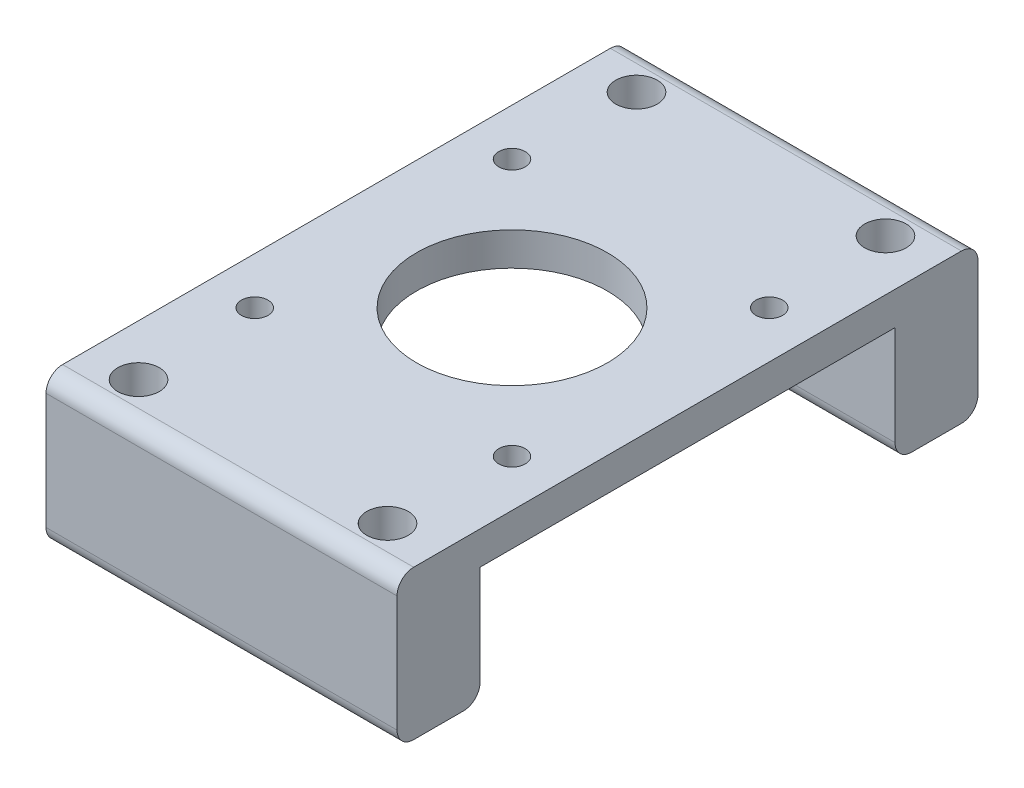
ISO-10303-21;
HEADER;
FILE_DESCRIPTION(('STEP AP214'),'2;1');
FILE_NAME('part.step','',(''),(''),'','','');
FILE_SCHEMA(('AUTOMOTIVE_DESIGN { 1 0 10303 214 1 1 1 1 }'));
ENDSEC;
DATA;
#1=APPLICATION_CONTEXT('core data for automotive mechanical design processes');
#2=APPLICATION_PROTOCOL_DEFINITION('international standard','automotive_design',2000,#1);
#3=PRODUCT_CONTEXT('',#1,'mechanical');
#4=PRODUCT('Part','Part','',(#3));
#5=PRODUCT_RELATED_PRODUCT_CATEGORY('part','',(#4));
#6=PRODUCT_DEFINITION_FORMATION('','',#4);
#7=PRODUCT_DEFINITION_CONTEXT('part definition',#1,'design');
#8=PRODUCT_DEFINITION('design','',#6,#7);
#9=PRODUCT_DEFINITION_SHAPE('','',#8);
#10=(LENGTH_UNIT() NAMED_UNIT(*) SI_UNIT(.MILLI.,.METRE.));
#11=(NAMED_UNIT(*) PLANE_ANGLE_UNIT() SI_UNIT($,.RADIAN.));
#12=(NAMED_UNIT(*) SI_UNIT($,.STERADIAN.) SOLID_ANGLE_UNIT());
#13=UNCERTAINTY_MEASURE_WITH_UNIT(LENGTH_MEASURE(1.E-05),#10,'distance_accuracy_value','');
#14=(GEOMETRIC_REPRESENTATION_CONTEXT(3) GLOBAL_UNCERTAINTY_ASSIGNED_CONTEXT((#13)) GLOBAL_UNIT_ASSIGNED_CONTEXT((#10,
#11,#12)) REPRESENTATION_CONTEXT('',''));
#15=CARTESIAN_POINT('',(0.,0.,0.));
#16=DIRECTION('',(0.,0.,1.));
#17=DIRECTION('',(1.,0.,0.));
#18=AXIS2_PLACEMENT_3D('',#15,#16,#17);
#19=CARTESIAN_POINT('',(21.15,2.,0.));
#20=DIRECTION('',(0.,-1.,0.));
#21=DIRECTION('',(0.,0.,-1.));
#22=AXIS2_PLACEMENT_3D('',#19,#20,#21);
#23=PLANE('',#22);
#24=CARTESIAN_POINT('',(15.,2.00000000000001,30.));
#25=DIRECTION('',(0.,1.,0.));
#26=DIRECTION('',(0.,0.,1.));
#27=AXIS2_PLACEMENT_3D('',#24,#25,#26);
#28=CIRCLE('',#27,2.5);
#29=CARTESIAN_POINT('',(15.,2.00000000000001,32.5));
#30=VERTEX_POINT('',#29);
#31=EDGE_CURVE('E311',#30,#30,#28,.T.);
#32=ORIENTED_EDGE('',*,*,#31,.F.);
#33=EDGE_LOOP('',(#32));
#34=FACE_BOUND('',#33,.T.);
#35=CARTESIAN_POINT('',(-15.,2.00000000000001,30.));
#36=DIRECTION('',(0.,-1.,0.));
#37=DIRECTION('',(0.,0.,1.));
#38=AXIS2_PLACEMENT_3D('',#35,#36,#37);
#39=CIRCLE('',#38,2.5);
#40=CARTESIAN_POINT('',(-15.,2.00000000000001,32.5));
#41=VERTEX_POINT('',#40);
#42=EDGE_CURVE('E305',#41,#41,#39,.T.);
#43=ORIENTED_EDGE('',*,*,#42,.T.);
#44=EDGE_LOOP('',(#43));
#45=FACE_BOUND('',#44,.T.);
#46=CARTESIAN_POINT('',(-15.,2.00000000000001,-30.));
#47=DIRECTION('',(0.,1.,0.));
#48=DIRECTION('',(0.,0.,-1.));
#49=AXIS2_PLACEMENT_3D('',#46,#47,#48);
#50=CIRCLE('',#49,2.5);
#51=CARTESIAN_POINT('',(-15.,2.00000000000001,-32.5));
#52=VERTEX_POINT('',#51);
#53=EDGE_CURVE('E299',#52,#52,#50,.T.);
#54=ORIENTED_EDGE('',*,*,#53,.F.);
#55=EDGE_LOOP('',(#54));
#56=FACE_BOUND('',#55,.T.);
#57=CARTESIAN_POINT('',(15.,2.00000000000001,-30.));
#58=DIRECTION('',(0.,-1.,0.));
#59=DIRECTION('',(0.,0.,-1.));
#60=AXIS2_PLACEMENT_3D('',#57,#58,#59);
#61=CIRCLE('',#60,2.5);
#62=CARTESIAN_POINT('',(15.,2.00000000000001,-32.5));
#63=VERTEX_POINT('',#62);
#64=EDGE_CURVE('E295',#63,#63,#61,.T.);
#65=ORIENTED_EDGE('',*,*,#64,.T.);
#66=EDGE_LOOP('',(#65));
#67=FACE_BOUND('',#66,.T.);
#68=CARTESIAN_POINT('',(15.4999999999998,2.00000000000001,-15.5000000000002));
#69=DIRECTION('',(0.,1.,0.));
#70=DIRECTION('',(-1.,0.,0.));
#71=AXIS2_PLACEMENT_3D('',#68,#69,#70);
#72=CIRCLE('',#71,1.6);
#73=CARTESIAN_POINT('',(13.8999999999998,2.00000000000001,-15.5000000000001));
#74=VERTEX_POINT('',#73);
#75=EDGE_CURVE('E218',#74,#74,#72,.T.);
#76=ORIENTED_EDGE('',*,*,#75,.F.);
#77=EDGE_LOOP('',(#76));
#78=FACE_BOUND('',#77,.T.);
#79=CARTESIAN_POINT('',(15.5,2.,15.5));
#80=DIRECTION('',(0.,1.,0.));
#81=DIRECTION('',(0.,0.,-1.));
#82=AXIS2_PLACEMENT_3D('',#79,#80,#81);
#83=CIRCLE('',#82,1.6);
#84=CARTESIAN_POINT('',(15.5,2.,13.9));
#85=VERTEX_POINT('',#84);
#86=EDGE_CURVE('E214',#85,#85,#83,.T.);
#87=ORIENTED_EDGE('',*,*,#86,.F.);
#88=EDGE_LOOP('',(#87));
#89=FACE_BOUND('',#88,.T.);
#90=CARTESIAN_POINT('',(-15.4999999999999,2.,15.5000000000001));
#91=DIRECTION('',(0.,1.,0.));
#92=DIRECTION('',(1.,0.,0.));
#93=AXIS2_PLACEMENT_3D('',#90,#91,#92);
#94=CIRCLE('',#93,1.6);
#95=CARTESIAN_POINT('',(-13.8999999999999,2.,15.5));
#96=VERTEX_POINT('',#95);
#97=EDGE_CURVE('E210',#96,#96,#94,.T.);
#98=ORIENTED_EDGE('',*,*,#97,.F.);
#99=EDGE_LOOP('',(#98));
#100=FACE_BOUND('',#99,.T.);
#101=CARTESIAN_POINT('',(-15.5,2.00000000000001,-15.5));
#102=DIRECTION('',(0.,1.,0.));
#103=DIRECTION('',(0.,0.,1.));
#104=AXIS2_PLACEMENT_3D('',#101,#102,#103);
#105=CIRCLE('',#104,1.6);
#106=CARTESIAN_POINT('',(-15.5,2.00000000000001,-13.9));
#107=VERTEX_POINT('',#106);
#108=EDGE_CURVE('E206',#107,#107,#105,.T.);
#109=ORIENTED_EDGE('',*,*,#108,.F.);
#110=EDGE_LOOP('',(#109));
#111=FACE_BOUND('',#110,.T.);
#112=CARTESIAN_POINT('',(0.,2.,0.));
#113=DIRECTION('',(0.,1.,0.));
#114=DIRECTION('',(0.,0.,1.));
#115=AXIS2_PLACEMENT_3D('',#112,#113,#114);
#116=CIRCLE('',#115,11.5);
#117=CARTESIAN_POINT('',(0.,2.,11.5));
#118=VERTEX_POINT('',#117);
#119=EDGE_CURVE('E202',#118,#118,#116,.T.);
#120=ORIENTED_EDGE('',*,*,#119,.F.);
#121=EDGE_LOOP('',(#120));
#122=FACE_BOUND('',#121,.T.);
#123=DIRECTION('',(0.,0.,1.));
#124=VECTOR('',#123,1.);
#125=CARTESIAN_POINT('',(-21.15,2.,0.));
#126=LINE('',#125,#124);
#127=CARTESIAN_POINT('',(-21.15,2.00000000000001,-33.));
#128=VERTEX_POINT('',#127);
#129=CARTESIAN_POINT('',(-21.15,2.,33.));
#130=VERTEX_POINT('',#129);
#131=EDGE_CURVE('E176',#128,#130,#126,.T.);
#132=ORIENTED_EDGE('',*,*,#131,.T.);
#133=DIRECTION('',(-1.,0.,0.));
#134=VECTOR('',#133,1.);
#135=CARTESIAN_POINT('',(21.15,2.,33.));
#136=LINE('',#135,#134);
#137=CARTESIAN_POINT('',(21.15,2.,33.));
#138=VERTEX_POINT('',#137);
#139=EDGE_CURVE('E11',#130,#138,#136,.F.);
#140=ORIENTED_EDGE('',*,*,#139,.T.);
#141=DIRECTION('',(0.,0.,1.));
#142=VECTOR('',#141,1.);
#143=CARTESIAN_POINT('',(21.15,2.,0.));
#144=LINE('',#143,#142);
#145=CARTESIAN_POINT('',(21.15,2.00000000000001,-33.));
#146=VERTEX_POINT('',#145);
#147=EDGE_CURVE('E198',#146,#138,#144,.T.);
#148=ORIENTED_EDGE('',*,*,#147,.F.);
#149=DIRECTION('',(-1.,0.,0.));
#150=VECTOR('',#149,1.);
#151=CARTESIAN_POINT('',(-21.15,2.00000000000001,-33.));
#152=LINE('',#151,#150);
#153=EDGE_CURVE('E43',#146,#128,#152,.T.);
#154=ORIENTED_EDGE('',*,*,#153,.T.);
#155=EDGE_LOOP('',(#132,#140,#148,#154));
#156=FACE_BOUND('',#155,.T.);
#157=ADVANCED_FACE('F35',(#34,#45,#56,#67,#78,#89,#100,#111,#122,#156),#23,.F.);
#158=CARTESIAN_POINT('',(21.15,0.,35.));
#159=DIRECTION('',(0.,0.,-1.));
#160=DIRECTION('',(0.,1.,0.));
#161=AXIS2_PLACEMENT_3D('',#158,#159,#160);
#162=PLANE('',#161);
#163=DIRECTION('',(0.,-1.,0.));
#164=VECTOR('',#163,1.);
#165=CARTESIAN_POINT('',(-21.15,0.,35.));
#166=LINE('',#165,#164);
#167=CARTESIAN_POINT('',(-21.15,0.,35.));
#168=VERTEX_POINT('',#167);
#169=CARTESIAN_POINT('',(-21.15,-14.,35.));
#170=VERTEX_POINT('',#169);
#171=EDGE_CURVE('E179',#168,#170,#166,.T.);
#172=ORIENTED_EDGE('',*,*,#171,.T.);
#173=DIRECTION('',(-1.,0.,0.));
#174=VECTOR('',#173,1.);
#175=CARTESIAN_POINT('',(21.15,-14.,35.));
#176=LINE('',#175,#174);
#177=CARTESIAN_POINT('',(21.15,-14.,35.));
#178=VERTEX_POINT('',#177);
#179=EDGE_CURVE('E238',#170,#178,#176,.F.);
#180=ORIENTED_EDGE('',*,*,#179,.T.);
#181=DIRECTION('',(0.,-1.,0.));
#182=VECTOR('',#181,1.);
#183=CARTESIAN_POINT('',(21.15,0.,35.));
#184=LINE('',#183,#182);
#185=CARTESIAN_POINT('',(21.15,0.,35.));
#186=VERTEX_POINT('',#185);
#187=EDGE_CURVE('E167',#186,#178,#184,.T.);
#188=ORIENTED_EDGE('',*,*,#187,.F.);
#189=DIRECTION('',(-1.,0.,0.));
#190=VECTOR('',#189,1.);
#191=CARTESIAN_POINT('',(21.15,0.,35.));
#192=LINE('',#191,#190);
#193=EDGE_CURVE('E235',#186,#168,#192,.T.);
#194=ORIENTED_EDGE('',*,*,#193,.T.);
#195=EDGE_LOOP('',(#172,#180,#188,#194));
#196=FACE_BOUND('',#195,.T.);
#197=ADVANCED_FACE('F280',(#196),#162,.F.);
#198=CARTESIAN_POINT('',(21.15,-16.,0.));
#199=DIRECTION('',(0.,-1.,0.));
#200=DIRECTION('',(0.,0.,-1.));
#201=AXIS2_PLACEMENT_3D('',#198,#199,#200);
#202=PLANE('',#201);
#203=CARTESIAN_POINT('',(15.,-16.,30.));
#204=DIRECTION('',(0.,1.,0.));
#205=DIRECTION('',(0.,0.,1.));
#206=AXIS2_PLACEMENT_3D('',#203,#204,#205);
#207=CIRCLE('',#206,2.5);
#208=CARTESIAN_POINT('',(15.,-16.,32.5));
#209=VERTEX_POINT('',#208);
#210=EDGE_CURVE('E314',#209,#209,#207,.T.);
#211=ORIENTED_EDGE('',*,*,#210,.T.);
#212=EDGE_LOOP('',(#211));
#213=FACE_BOUND('',#212,.T.);
#214=CARTESIAN_POINT('',(-15.,-16.,30.));
#215=DIRECTION('',(0.,-1.,0.));
#216=DIRECTION('',(0.,0.,1.));
#217=AXIS2_PLACEMENT_3D('',#214,#215,#216);
#218=CIRCLE('',#217,2.5);
#219=CARTESIAN_POINT('',(-15.,-16.,32.5));
#220=VERTEX_POINT('',#219);
#221=EDGE_CURVE('E308',#220,#220,#218,.T.);
#222=ORIENTED_EDGE('',*,*,#221,.F.);
#223=EDGE_LOOP('',(#222));
#224=FACE_BOUND('',#223,.T.);
#225=DIRECTION('',(0.,0.,1.));
#226=VECTOR('',#225,1.);
#227=CARTESIAN_POINT('',(21.15,-16.,0.));
#228=LINE('',#227,#226);
#229=CARTESIAN_POINT('',(21.15,-16.,27.));
#230=VERTEX_POINT('',#229);
#231=CARTESIAN_POINT('',(21.15,-16.,33.));
#232=VERTEX_POINT('',#231);
#233=EDGE_CURVE('E164',#230,#232,#228,.T.);
#234=ORIENTED_EDGE('',*,*,#233,.T.);
#235=DIRECTION('',(-1.,0.,0.));
#236=VECTOR('',#235,1.);
#237=CARTESIAN_POINT('',(-21.15,-16.,33.));
#238=LINE('',#237,#236);
#239=CARTESIAN_POINT('',(-21.15,-16.,33.));
#240=VERTEX_POINT('',#239);
#241=EDGE_CURVE('E220',#232,#240,#238,.T.);
#242=ORIENTED_EDGE('',*,*,#241,.T.);
#243=DIRECTION('',(0.,0.,1.));
#244=VECTOR('',#243,1.);
#245=CARTESIAN_POINT('',(-21.15,-16.,0.));
#246=LINE('',#245,#244);
#247=CARTESIAN_POINT('',(-21.15,-16.,27.));
#248=VERTEX_POINT('',#247);
#249=EDGE_CURVE('E183',#248,#240,#246,.T.);
#250=ORIENTED_EDGE('',*,*,#249,.F.);
#251=DIRECTION('',(-1.,0.,0.));
#252=VECTOR('',#251,1.);
#253=CARTESIAN_POINT('',(21.15,-16.,27.));
#254=LINE('',#253,#252);
#255=EDGE_CURVE('E148',#248,#230,#254,.F.);
#256=ORIENTED_EDGE('',*,*,#255,.T.);
#257=EDGE_LOOP('',(#234,#242,#250,#256));
#258=FACE_BOUND('',#257,.T.);
#259=ADVANCED_FACE('F360',(#213,#224,#258),#202,.T.);
#260=CARTESIAN_POINT('',(21.15,0.,25.));
#261=DIRECTION('',(0.,0.,-1.));
#262=DIRECTION('',(0.,1.,0.));
#263=AXIS2_PLACEMENT_3D('',#260,#261,#262);
#264=PLANE('',#263);
#265=DIRECTION('',(0.,-1.,0.));
#266=VECTOR('',#265,1.);
#267=CARTESIAN_POINT('',(21.15,0.,25.));
#268=LINE('',#267,#266);
#269=CARTESIAN_POINT('',(21.15,-2.,25.));
#270=VERTEX_POINT('',#269);
#271=CARTESIAN_POINT('',(21.15,-14.,25.));
#272=VERTEX_POINT('',#271);
#273=EDGE_CURVE('E142',#270,#272,#268,.T.);
#274=ORIENTED_EDGE('',*,*,#273,.T.);
#275=DIRECTION('',(-1.,0.,0.));
#276=VECTOR('',#275,1.);
#277=CARTESIAN_POINT('',(21.15,-14.,25.));
#278=LINE('',#277,#276);
#279=CARTESIAN_POINT('',(-21.15,-14.,25.));
#280=VERTEX_POINT('',#279);
#281=EDGE_CURVE('E250',#272,#280,#278,.T.);
#282=ORIENTED_EDGE('',*,*,#281,.T.);
#283=DIRECTION('',(0.,-1.,0.));
#284=VECTOR('',#283,1.);
#285=CARTESIAN_POINT('',(-21.15,0.,25.));
#286=LINE('',#285,#284);
#287=CARTESIAN_POINT('',(-21.15,-2.,25.));
#288=VERTEX_POINT('',#287);
#289=EDGE_CURVE('E145',#288,#280,#286,.T.);
#290=ORIENTED_EDGE('',*,*,#289,.F.);
#291=DIRECTION('',(-1.,0.,0.));
#292=VECTOR('',#291,1.);
#293=CARTESIAN_POINT('',(21.15,-2.,25.));
#294=LINE('',#293,#292);
#295=EDGE_CURVE('E137',#270,#288,#294,.T.);
#296=ORIENTED_EDGE('',*,*,#295,.F.);
#297=EDGE_LOOP('',(#274,#282,#290,#296));
#298=FACE_BOUND('',#297,.T.);
#299=ADVANCED_FACE('F139',(#298),#264,.T.);
#300=CARTESIAN_POINT('',(21.15,-2.,0.));
#301=DIRECTION('',(0.,1.,0.));
#302=DIRECTION('',(0.,0.,1.));
#303=AXIS2_PLACEMENT_3D('',#300,#301,#302);
#304=PLANE('',#303);
#305=CARTESIAN_POINT('',(15.4999999999998,-2.,-15.5000000000002));
#306=DIRECTION('',(0.,1.,0.));
#307=DIRECTION('',(0.,0.,1.));
#308=AXIS2_PLACEMENT_3D('',#305,#306,#307);
#309=CIRCLE('',#308,1.6);
#310=CARTESIAN_POINT('',(15.4999999999998,-2.,-13.9000000000002));
#311=VERTEX_POINT('',#310);
#312=EDGE_CURVE('E215',#311,#311,#309,.T.);
#313=ORIENTED_EDGE('',*,*,#312,.T.);
#314=EDGE_LOOP('',(#313));
#315=FACE_BOUND('',#314,.T.);
#316=CARTESIAN_POINT('',(15.5,-2.,15.5));
#317=DIRECTION('',(0.,1.,0.));
#318=DIRECTION('',(0.,0.,1.));
#319=AXIS2_PLACEMENT_3D('',#316,#317,#318);
#320=CIRCLE('',#319,1.6);
#321=CARTESIAN_POINT('',(15.5,-2.,17.1));
#322=VERTEX_POINT('',#321);
#323=EDGE_CURVE('E211',#322,#322,#320,.T.);
#324=ORIENTED_EDGE('',*,*,#323,.T.);
#325=EDGE_LOOP('',(#324));
#326=FACE_BOUND('',#325,.T.);
#327=CARTESIAN_POINT('',(-15.4999999999999,-2.,15.5000000000001));
#328=DIRECTION('',(0.,1.,0.));
#329=DIRECTION('',(0.,0.,1.));
#330=AXIS2_PLACEMENT_3D('',#327,#328,#329);
#331=CIRCLE('',#330,1.6);
#332=CARTESIAN_POINT('',(-15.4999999999999,-2.,17.1000000000001));
#333=VERTEX_POINT('',#332);
#334=EDGE_CURVE('E207',#333,#333,#331,.T.);
#335=ORIENTED_EDGE('',*,*,#334,.T.);
#336=EDGE_LOOP('',(#335));
#337=FACE_BOUND('',#336,.T.);
#338=CARTESIAN_POINT('',(-15.5,-2.,-15.5));
#339=DIRECTION('',(0.,1.,0.));
#340=DIRECTION('',(0.,0.,1.));
#341=AXIS2_PLACEMENT_3D('',#338,#339,#340);
#342=CIRCLE('',#341,1.6);
#343=CARTESIAN_POINT('',(-15.5,-2.,-13.9));
#344=VERTEX_POINT('',#343);
#345=EDGE_CURVE('E203',#344,#344,#342,.T.);
#346=ORIENTED_EDGE('',*,*,#345,.T.);
#347=EDGE_LOOP('',(#346));
#348=FACE_BOUND('',#347,.T.);
#349=CARTESIAN_POINT('',(0.,-2.,0.));
#350=DIRECTION('',(0.,1.,0.));
#351=DIRECTION('',(0.,0.,1.));
#352=AXIS2_PLACEMENT_3D('',#349,#350,#351);
#353=CIRCLE('',#352,11.5);
#354=CARTESIAN_POINT('',(0.,-2.,11.5));
#355=VERTEX_POINT('',#354);
#356=EDGE_CURVE('E180',#355,#355,#353,.T.);
#357=ORIENTED_EDGE('',*,*,#356,.T.);
#358=EDGE_LOOP('',(#357));
#359=FACE_BOUND('',#358,.T.);
#360=DIRECTION('',(0.,0.,-1.));
#361=VECTOR('',#360,1.);
#362=CARTESIAN_POINT('',(-21.15,-2.,0.));
#363=LINE('',#362,#361);
#364=CARTESIAN_POINT('',(-21.15,-2.,-25.));
#365=VERTEX_POINT('',#364);
#366=EDGE_CURVE('E187',#288,#365,#363,.T.);
#367=ORIENTED_EDGE('',*,*,#366,.T.);
#368=DIRECTION('',(-1.,0.,0.));
#369=VECTOR('',#368,1.);
#370=CARTESIAN_POINT('',(21.15,-2.,-25.));
#371=LINE('',#370,#369);
#372=CARTESIAN_POINT('',(21.15,-2.,-25.));
#373=VERTEX_POINT('',#372);
#374=EDGE_CURVE('E149',#373,#365,#371,.T.);
#375=ORIENTED_EDGE('',*,*,#374,.F.);
#376=DIRECTION('',(0.,0.,-1.));
#377=VECTOR('',#376,1.);
#378=CARTESIAN_POINT('',(21.15,-2.,0.));
#379=LINE('',#378,#377);
#380=EDGE_CURVE('E152',#270,#373,#379,.T.);
#381=ORIENTED_EDGE('',*,*,#380,.F.);
#382=ORIENTED_EDGE('',*,*,#295,.T.);
#383=EDGE_LOOP('',(#367,#375,#381,#382));
#384=FACE_BOUND('',#383,.T.);
#385=ADVANCED_FACE('F153',(#315,#326,#337,#348,#359,#384),#304,.F.);
#386=CARTESIAN_POINT('',(21.15,0.,-25.));
#387=DIRECTION('',(0.,0.,-1.));
#388=DIRECTION('',(-1.,0.,0.));
#389=AXIS2_PLACEMENT_3D('',#386,#387,#388);
#390=PLANE('',#389);
#391=DIRECTION('',(0.,-1.,0.));
#392=VECTOR('',#391,1.);
#393=CARTESIAN_POINT('',(-21.15,0.,-25.));
#394=LINE('',#393,#392);
#395=CARTESIAN_POINT('',(-21.15,-14.,-25.));
#396=VERTEX_POINT('',#395);
#397=EDGE_CURVE('E189',#365,#396,#394,.T.);
#398=ORIENTED_EDGE('',*,*,#397,.T.);
#399=DIRECTION('',(-1.,0.,0.));
#400=VECTOR('',#399,1.);
#401=CARTESIAN_POINT('',(21.15,-14.,-25.));
#402=LINE('',#401,#400);
#403=CARTESIAN_POINT('',(21.15,-14.,-25.));
#404=VERTEX_POINT('',#403);
#405=EDGE_CURVE('E261',#396,#404,#402,.F.);
#406=ORIENTED_EDGE('',*,*,#405,.T.);
#407=DIRECTION('',(0.,-1.,0.));
#408=VECTOR('',#407,1.);
#409=CARTESIAN_POINT('',(21.15,0.,-25.));
#410=LINE('',#409,#408);
#411=EDGE_CURVE('E157',#373,#404,#410,.T.);
#412=ORIENTED_EDGE('',*,*,#411,.F.);
#413=ORIENTED_EDGE('',*,*,#374,.T.);
#414=EDGE_LOOP('',(#398,#406,#412,#413));
#415=FACE_BOUND('',#414,.T.);
#416=ADVANCED_FACE('F350',(#415),#390,.F.);
#417=CARTESIAN_POINT('',(21.15,-16.,0.));
#418=DIRECTION('',(0.,1.,0.));
#419=DIRECTION('',(0.,0.,1.));
#420=AXIS2_PLACEMENT_3D('',#417,#418,#419);
#421=PLANE('',#420);
#422=CARTESIAN_POINT('',(-15.,-16.,-30.));
#423=DIRECTION('',(0.,1.,0.));
#424=DIRECTION('',(0.,0.,-1.));
#425=AXIS2_PLACEMENT_3D('',#422,#423,#424);
#426=CIRCLE('',#425,2.5);
#427=CARTESIAN_POINT('',(-15.,-16.,-32.5));
#428=VERTEX_POINT('',#427);
#429=EDGE_CURVE('E302',#428,#428,#426,.T.);
#430=ORIENTED_EDGE('',*,*,#429,.T.);
#431=EDGE_LOOP('',(#430));
#432=FACE_BOUND('',#431,.T.);
#433=CARTESIAN_POINT('',(15.,-16.,-30.));
#434=DIRECTION('',(0.,-1.,0.));
#435=DIRECTION('',(0.,0.,-1.));
#436=AXIS2_PLACEMENT_3D('',#433,#434,#435);
#437=CIRCLE('',#436,2.5);
#438=CARTESIAN_POINT('',(15.,-16.,-32.5));
#439=VERTEX_POINT('',#438);
#440=EDGE_CURVE('E296',#439,#439,#437,.T.);
#441=ORIENTED_EDGE('',*,*,#440,.F.);
#442=EDGE_LOOP('',(#441));
#443=FACE_BOUND('',#442,.T.);
#444=DIRECTION('',(0.,0.,-1.));
#445=VECTOR('',#444,1.);
#446=CARTESIAN_POINT('',(-21.15,-16.,0.));
#447=LINE('',#446,#445);
#448=CARTESIAN_POINT('',(-21.15,-16.,-27.));
#449=VERTEX_POINT('',#448);
#450=CARTESIAN_POINT('',(-21.15,-16.,-33.));
#451=VERTEX_POINT('',#450);
#452=EDGE_CURVE('E192',#449,#451,#447,.T.);
#453=ORIENTED_EDGE('',*,*,#452,.T.);
#454=DIRECTION('',(-1.,0.,0.));
#455=VECTOR('',#454,1.);
#456=CARTESIAN_POINT('',(21.15,-16.,-33.));
#457=LINE('',#456,#455);
#458=CARTESIAN_POINT('',(21.15,-16.,-33.));
#459=VERTEX_POINT('',#458);
#460=EDGE_CURVE('E259',#451,#459,#457,.F.);
#461=ORIENTED_EDGE('',*,*,#460,.T.);
#462=DIRECTION('',(0.,0.,-1.));
#463=VECTOR('',#462,1.);
#464=CARTESIAN_POINT('',(21.15,-16.,0.));
#465=LINE('',#464,#463);
#466=CARTESIAN_POINT('',(21.15,-16.,-27.));
#467=VERTEX_POINT('',#466);
#468=EDGE_CURVE('E172',#467,#459,#465,.T.);
#469=ORIENTED_EDGE('',*,*,#468,.F.);
#470=DIRECTION('',(-1.,0.,0.));
#471=VECTOR('',#470,1.);
#472=CARTESIAN_POINT('',(21.15,-16.,-27.));
#473=LINE('',#472,#471);
#474=EDGE_CURVE('E256',#467,#449,#473,.T.);
#475=ORIENTED_EDGE('',*,*,#474,.T.);
#476=EDGE_LOOP('',(#453,#461,#469,#475));
#477=FACE_BOUND('',#476,.T.);
#478=ADVANCED_FACE('F357',(#432,#443,#477),#421,.F.);
#479=CARTESIAN_POINT('',(21.15,0.,-35.));
#480=DIRECTION('',(0.,0.,-1.));
#481=DIRECTION('',(-1.,0.,0.));
#482=AXIS2_PLACEMENT_3D('',#479,#480,#481);
#483=PLANE('',#482);
#484=DIRECTION('',(0.,-1.,0.));
#485=VECTOR('',#484,1.);
#486=CARTESIAN_POINT('',(21.15,0.,-35.));
#487=LINE('',#486,#485);
#488=CARTESIAN_POINT('',(21.15,0.,-35.));
#489=VERTEX_POINT('',#488);
#490=CARTESIAN_POINT('',(21.15,-14.,-35.));
#491=VERTEX_POINT('',#490);
#492=EDGE_CURVE('E174',#489,#491,#487,.T.);
#493=ORIENTED_EDGE('',*,*,#492,.T.);
#494=DIRECTION('',(-1.,0.,0.));
#495=VECTOR('',#494,1.);
#496=CARTESIAN_POINT('',(-21.15,-14.,-35.));
#497=LINE('',#496,#495);
#498=CARTESIAN_POINT('',(-21.15,-14.,-35.));
#499=VERTEX_POINT('',#498);
#500=EDGE_CURVE('E253',#491,#499,#497,.T.);
#501=ORIENTED_EDGE('',*,*,#500,.T.);
#502=DIRECTION('',(0.,-1.,0.));
#503=VECTOR('',#502,1.);
#504=CARTESIAN_POINT('',(-21.15,0.,-35.));
#505=LINE('',#504,#503);
#506=CARTESIAN_POINT('',(-21.15,0.,-35.));
#507=VERTEX_POINT('',#506);
#508=EDGE_CURVE('E195',#507,#499,#505,.T.);
#509=ORIENTED_EDGE('',*,*,#508,.F.);
#510=DIRECTION('',(-1.,0.,0.));
#511=VECTOR('',#510,1.);
#512=CARTESIAN_POINT('',(21.15,0.,-35.));
#513=LINE('',#512,#511);
#514=EDGE_CURVE('E57',#507,#489,#513,.F.);
#515=ORIENTED_EDGE('',*,*,#514,.T.);
#516=EDGE_LOOP('',(#493,#501,#509,#515));
#517=FACE_BOUND('',#516,.T.);
#518=ADVANCED_FACE('F392',(#517),#483,.T.);
#519=CARTESIAN_POINT('',(21.15,0.,0.));
#520=DIRECTION('',(1.,0.,0.));
#521=DIRECTION('',(0.,0.,-1.));
#522=AXIS2_PLACEMENT_3D('',#519,#520,#521);
#523=PLANE('',#522);
#524=ORIENTED_EDGE('',*,*,#187,.T.);
#525=CARTESIAN_POINT('',(21.15,-14.,33.));
#526=DIRECTION('',(1.,0.,0.));
#527=DIRECTION('',(0.,0.,-1.));
#528=AXIS2_PLACEMENT_3D('',#525,#526,#527);
#529=CIRCLE('',#528,2.);
#530=EDGE_CURVE('E248',#178,#232,#529,.T.);
#531=ORIENTED_EDGE('',*,*,#530,.T.);
#532=ORIENTED_EDGE('',*,*,#233,.F.);
#533=CARTESIAN_POINT('',(21.15,-14.,27.));
#534=DIRECTION('',(1.,0.,0.));
#535=DIRECTION('',(0.,0.,-1.));
#536=AXIS2_PLACEMENT_3D('',#533,#534,#535);
#537=CIRCLE('',#536,2.);
#538=EDGE_CURVE('E163',#230,#272,#537,.T.);
#539=ORIENTED_EDGE('',*,*,#538,.T.);
#540=ORIENTED_EDGE('',*,*,#273,.F.);
#541=ORIENTED_EDGE('',*,*,#380,.T.);
#542=ORIENTED_EDGE('',*,*,#411,.T.);
#543=CARTESIAN_POINT('',(21.15,-14.,-27.));
#544=DIRECTION('',(1.,0.,0.));
#545=DIRECTION('',(0.,0.,-1.));
#546=AXIS2_PLACEMENT_3D('',#543,#544,#545);
#547=CIRCLE('',#546,2.);
#548=EDGE_CURVE('E244',#404,#467,#547,.T.);
#549=ORIENTED_EDGE('',*,*,#548,.T.);
#550=ORIENTED_EDGE('',*,*,#468,.T.);
#551=CARTESIAN_POINT('',(21.15,-14.,-33.));
#552=DIRECTION('',(1.,0.,0.));
#553=DIRECTION('',(0.,0.,-1.));
#554=AXIS2_PLACEMENT_3D('',#551,#552,#553);
#555=CIRCLE('',#554,2.);
#556=EDGE_CURVE('E50',#459,#491,#555,.T.);
#557=ORIENTED_EDGE('',*,*,#556,.T.);
#558=ORIENTED_EDGE('',*,*,#492,.F.);
#559=CARTESIAN_POINT('',(21.15,0.,-33.));
#560=DIRECTION('',(1.,0.,0.));
#561=DIRECTION('',(0.,0.,-1.));
#562=AXIS2_PLACEMENT_3D('',#559,#560,#561);
#563=CIRCLE('',#562,2.);
#564=EDGE_CURVE('E240',#489,#146,#563,.T.);
#565=ORIENTED_EDGE('',*,*,#564,.T.);
#566=ORIENTED_EDGE('',*,*,#147,.T.);
#567=CARTESIAN_POINT('',(21.15,0.,33.));
#568=DIRECTION('',(1.,0.,0.));
#569=DIRECTION('',(0.,0.,-1.));
#570=AXIS2_PLACEMENT_3D('',#567,#568,#569);
#571=CIRCLE('',#570,2.);
#572=EDGE_CURVE('E242',#138,#186,#571,.T.);
#573=ORIENTED_EDGE('',*,*,#572,.T.);
#574=EDGE_LOOP('',(#524,#531,#532,#539,#540,#541,#542,#549,#550,#557,#558,#565,#566,#573));
#575=FACE_BOUND('',#574,.T.);
#576=ADVANCED_FACE('F160',(#575),#523,.T.);
#577=CARTESIAN_POINT('',(-21.15,0.,0.));
#578=DIRECTION('',(1.,0.,0.));
#579=DIRECTION('',(0.,0.,-1.));
#580=AXIS2_PLACEMENT_3D('',#577,#578,#579);
#581=PLANE('',#580);
#582=ORIENTED_EDGE('',*,*,#249,.T.);
#583=CARTESIAN_POINT('',(-21.15,-14.,33.));
#584=DIRECTION('',(1.,0.,0.));
#585=DIRECTION('',(0.,0.,-1.));
#586=AXIS2_PLACEMENT_3D('',#583,#584,#585);
#587=CIRCLE('',#586,2.);
#588=EDGE_CURVE('E233',#240,#170,#587,.F.);
#589=ORIENTED_EDGE('',*,*,#588,.T.);
#590=ORIENTED_EDGE('',*,*,#171,.F.);
#591=CARTESIAN_POINT('',(-21.15,0.,33.));
#592=DIRECTION('',(1.,0.,0.));
#593=DIRECTION('',(0.,0.,-1.));
#594=AXIS2_PLACEMENT_3D('',#591,#592,#593);
#595=CIRCLE('',#594,2.);
#596=EDGE_CURVE('E225',#168,#130,#595,.F.);
#597=ORIENTED_EDGE('',*,*,#596,.T.);
#598=ORIENTED_EDGE('',*,*,#131,.F.);
#599=CARTESIAN_POINT('',(-21.15,0.,-33.));
#600=DIRECTION('',(1.,0.,0.));
#601=DIRECTION('',(0.,0.,-1.));
#602=AXIS2_PLACEMENT_3D('',#599,#600,#601);
#603=CIRCLE('',#602,2.);
#604=EDGE_CURVE('E223',#128,#507,#603,.F.);
#605=ORIENTED_EDGE('',*,*,#604,.T.);
#606=ORIENTED_EDGE('',*,*,#508,.T.);
#607=CARTESIAN_POINT('',(-21.15,-14.,-33.));
#608=DIRECTION('',(1.,0.,0.));
#609=DIRECTION('',(0.,0.,-1.));
#610=AXIS2_PLACEMENT_3D('',#607,#608,#609);
#611=CIRCLE('',#610,2.);
#612=EDGE_CURVE('E229',#499,#451,#611,.F.);
#613=ORIENTED_EDGE('',*,*,#612,.T.);
#614=ORIENTED_EDGE('',*,*,#452,.F.);
#615=CARTESIAN_POINT('',(-21.15,-14.,-27.));
#616=DIRECTION('',(1.,0.,0.));
#617=DIRECTION('',(0.,0.,-1.));
#618=AXIS2_PLACEMENT_3D('',#615,#616,#617);
#619=CIRCLE('',#618,2.);
#620=EDGE_CURVE('E227',#449,#396,#619,.F.);
#621=ORIENTED_EDGE('',*,*,#620,.T.);
#622=ORIENTED_EDGE('',*,*,#397,.F.);
#623=ORIENTED_EDGE('',*,*,#366,.F.);
#624=ORIENTED_EDGE('',*,*,#289,.T.);
#625=CARTESIAN_POINT('',(-21.15,-14.,27.));
#626=DIRECTION('',(1.,0.,0.));
#627=DIRECTION('',(0.,0.,-1.));
#628=AXIS2_PLACEMENT_3D('',#625,#626,#627);
#629=CIRCLE('',#628,2.);
#630=EDGE_CURVE('E231',#280,#248,#629,.F.);
#631=ORIENTED_EDGE('',*,*,#630,.T.);
#632=EDGE_LOOP('',(#582,#589,#590,#597,#598,#605,#606,#613,#614,#621,#622,#623,#624,#631));
#633=FACE_BOUND('',#632,.T.);
#634=ADVANCED_FACE('F272',(#633),#581,.F.);
#635=CARTESIAN_POINT('',(0.,-16.,0.));
#636=DIRECTION('',(0.,1.,0.));
#637=DIRECTION('',(0.,0.,1.));
#638=AXIS2_PLACEMENT_3D('',#635,#636,#637);
#639=CYLINDRICAL_SURFACE('',#638,11.5);
#640=ORIENTED_EDGE('',*,*,#119,.T.);
#641=EDGE_LOOP('',(#640));
#642=FACE_BOUND('',#641,.T.);
#643=ORIENTED_EDGE('',*,*,#356,.F.);
#644=EDGE_LOOP('',(#643));
#645=FACE_BOUND('',#644,.T.);
#646=ADVANCED_FACE('F342',(#642,#645),#639,.F.);
#647=CARTESIAN_POINT('',(-15.5,-16.,-15.5));
#648=DIRECTION('',(0.,1.,0.));
#649=DIRECTION('',(0.,0.,1.));
#650=AXIS2_PLACEMENT_3D('',#647,#648,#649);
#651=CYLINDRICAL_SURFACE('',#650,1.6);
#652=ORIENTED_EDGE('',*,*,#108,.T.);
#653=EDGE_LOOP('',(#652));
#654=FACE_BOUND('',#653,.T.);
#655=ORIENTED_EDGE('',*,*,#345,.F.);
#656=EDGE_LOOP('',(#655));
#657=FACE_BOUND('',#656,.T.);
#658=ADVANCED_FACE('F345',(#654,#657),#651,.F.);
#659=CARTESIAN_POINT('',(-15.4999999999999,-16.,15.5000000000001));
#660=DIRECTION('',(0.,1.,0.));
#661=DIRECTION('',(0.,0.,1.));
#662=AXIS2_PLACEMENT_3D('',#659,#660,#661);
#663=CYLINDRICAL_SURFACE('',#662,1.6);
#664=ORIENTED_EDGE('',*,*,#97,.T.);
#665=EDGE_LOOP('',(#664));
#666=FACE_BOUND('',#665,.T.);
#667=ORIENTED_EDGE('',*,*,#334,.F.);
#668=EDGE_LOOP('',(#667));
#669=FACE_BOUND('',#668,.T.);
#670=ADVANCED_FACE('F419',(#666,#669),#663,.F.);
#671=CARTESIAN_POINT('',(15.5,-16.,15.5));
#672=DIRECTION('',(0.,1.,0.));
#673=DIRECTION('',(0.,0.,1.));
#674=AXIS2_PLACEMENT_3D('',#671,#672,#673);
#675=CYLINDRICAL_SURFACE('',#674,1.6);
#676=ORIENTED_EDGE('',*,*,#86,.T.);
#677=EDGE_LOOP('',(#676));
#678=FACE_BOUND('',#677,.T.);
#679=ORIENTED_EDGE('',*,*,#323,.F.);
#680=EDGE_LOOP('',(#679));
#681=FACE_BOUND('',#680,.T.);
#682=ADVANCED_FACE('F423',(#678,#681),#675,.F.);
#683=CARTESIAN_POINT('',(15.4999999999998,-16.,-15.5000000000002));
#684=DIRECTION('',(0.,1.,0.));
#685=DIRECTION('',(0.,0.,1.));
#686=AXIS2_PLACEMENT_3D('',#683,#684,#685);
#687=CYLINDRICAL_SURFACE('',#686,1.6);
#688=ORIENTED_EDGE('',*,*,#75,.T.);
#689=EDGE_LOOP('',(#688));
#690=FACE_BOUND('',#689,.T.);
#691=ORIENTED_EDGE('',*,*,#312,.F.);
#692=EDGE_LOOP('',(#691));
#693=FACE_BOUND('',#692,.T.);
#694=ADVANCED_FACE('F427',(#690,#693),#687,.F.);
#695=CARTESIAN_POINT('',(15.,2.00000000000001,-30.));
#696=DIRECTION('',(0.,-1.,0.));
#697=DIRECTION('',(0.,0.,-1.));
#698=AXIS2_PLACEMENT_3D('',#695,#696,#697);
#699=CYLINDRICAL_SURFACE('',#698,2.5);
#700=ORIENTED_EDGE('',*,*,#64,.F.);
#701=EDGE_LOOP('',(#700));
#702=FACE_BOUND('',#701,.T.);
#703=ORIENTED_EDGE('',*,*,#440,.T.);
#704=EDGE_LOOP('',(#703));
#705=FACE_BOUND('',#704,.T.);
#706=ADVANCED_FACE('F431',(#702,#705),#699,.F.);
#707=CARTESIAN_POINT('',(-15.,2.00000000000001,-30.));
#708=DIRECTION('',(0.,-1.,0.));
#709=DIRECTION('',(0.,0.,-1.));
#710=AXIS2_PLACEMENT_3D('',#707,#708,#709);
#711=CYLINDRICAL_SURFACE('',#710,2.5);
#712=ORIENTED_EDGE('',*,*,#53,.T.);
#713=EDGE_LOOP('',(#712));
#714=FACE_BOUND('',#713,.T.);
#715=ORIENTED_EDGE('',*,*,#429,.F.);
#716=EDGE_LOOP('',(#715));
#717=FACE_BOUND('',#716,.T.);
#718=ADVANCED_FACE('F435',(#714,#717),#711,.F.);
#719=CARTESIAN_POINT('',(-15.,2.00000000000001,30.));
#720=DIRECTION('',(0.,-1.,0.));
#721=DIRECTION('',(0.,0.,-1.));
#722=AXIS2_PLACEMENT_3D('',#719,#720,#721);
#723=CYLINDRICAL_SURFACE('',#722,2.5);
#724=ORIENTED_EDGE('',*,*,#42,.F.);
#725=EDGE_LOOP('',(#724));
#726=FACE_BOUND('',#725,.T.);
#727=ORIENTED_EDGE('',*,*,#221,.T.);
#728=EDGE_LOOP('',(#727));
#729=FACE_BOUND('',#728,.T.);
#730=ADVANCED_FACE('F439',(#726,#729),#723,.F.);
#731=CARTESIAN_POINT('',(15.,2.00000000000001,30.));
#732=DIRECTION('',(0.,-1.,0.));
#733=DIRECTION('',(0.,0.,-1.));
#734=AXIS2_PLACEMENT_3D('',#731,#732,#733);
#735=CYLINDRICAL_SURFACE('',#734,2.5);
#736=ORIENTED_EDGE('',*,*,#31,.T.);
#737=EDGE_LOOP('',(#736));
#738=FACE_BOUND('',#737,.T.);
#739=ORIENTED_EDGE('',*,*,#210,.F.);
#740=EDGE_LOOP('',(#739));
#741=FACE_BOUND('',#740,.T.);
#742=ADVANCED_FACE('F320',(#738,#741),#735,.F.);
#743=CARTESIAN_POINT('',(21.15,-14.,33.));
#744=DIRECTION('',(1.,0.,0.));
#745=DIRECTION('',(0.,0.,-1.));
#746=AXIS2_PLACEMENT_3D('',#743,#744,#745);
#747=CYLINDRICAL_SURFACE('',#746,2.);
#748=ORIENTED_EDGE('',*,*,#530,.F.);
#749=ORIENTED_EDGE('',*,*,#179,.F.);
#750=ORIENTED_EDGE('',*,*,#588,.F.);
#751=ORIENTED_EDGE('',*,*,#241,.F.);
#752=EDGE_LOOP('',(#748,#749,#750,#751));
#753=FACE_BOUND('',#752,.T.);
#754=ADVANCED_FACE('F370',(#753),#747,.T.);
#755=CARTESIAN_POINT('',(21.15,-14.,27.));
#756=DIRECTION('',(-1.,0.,0.));
#757=DIRECTION('',(0.,0.,1.));
#758=AXIS2_PLACEMENT_3D('',#755,#756,#757);
#759=CYLINDRICAL_SURFACE('',#758,2.);
#760=ORIENTED_EDGE('',*,*,#538,.F.);
#761=ORIENTED_EDGE('',*,*,#255,.F.);
#762=ORIENTED_EDGE('',*,*,#630,.F.);
#763=ORIENTED_EDGE('',*,*,#281,.F.);
#764=EDGE_LOOP('',(#760,#761,#762,#763));
#765=FACE_BOUND('',#764,.T.);
#766=ADVANCED_FACE('F373',(#765),#759,.T.);
#767=CARTESIAN_POINT('',(21.15,-14.,-33.));
#768=DIRECTION('',(1.,0.,0.));
#769=DIRECTION('',(0.,0.,-1.));
#770=AXIS2_PLACEMENT_3D('',#767,#768,#769);
#771=CYLINDRICAL_SURFACE('',#770,2.);
#772=ORIENTED_EDGE('',*,*,#556,.F.);
#773=ORIENTED_EDGE('',*,*,#460,.F.);
#774=ORIENTED_EDGE('',*,*,#612,.F.);
#775=ORIENTED_EDGE('',*,*,#500,.F.);
#776=EDGE_LOOP('',(#772,#773,#774,#775));
#777=FACE_BOUND('',#776,.T.);
#778=ADVANCED_FACE('F377',(#777),#771,.T.);
#779=CARTESIAN_POINT('',(21.15,-14.,-27.));
#780=DIRECTION('',(-1.,0.,0.));
#781=DIRECTION('',(0.,0.,1.));
#782=AXIS2_PLACEMENT_3D('',#779,#780,#781);
#783=CYLINDRICAL_SURFACE('',#782,2.);
#784=ORIENTED_EDGE('',*,*,#548,.F.);
#785=ORIENTED_EDGE('',*,*,#405,.F.);
#786=ORIENTED_EDGE('',*,*,#620,.F.);
#787=ORIENTED_EDGE('',*,*,#474,.F.);
#788=EDGE_LOOP('',(#784,#785,#786,#787));
#789=FACE_BOUND('',#788,.T.);
#790=ADVANCED_FACE('F381',(#789),#783,.T.);
#791=CARTESIAN_POINT('',(21.15,0.,33.));
#792=DIRECTION('',(-1.,0.,0.));
#793=DIRECTION('',(0.,0.,1.));
#794=AXIS2_PLACEMENT_3D('',#791,#792,#793);
#795=CYLINDRICAL_SURFACE('',#794,2.);
#796=ORIENTED_EDGE('',*,*,#572,.F.);
#797=ORIENTED_EDGE('',*,*,#139,.F.);
#798=ORIENTED_EDGE('',*,*,#596,.F.);
#799=ORIENTED_EDGE('',*,*,#193,.F.);
#800=EDGE_LOOP('',(#796,#797,#798,#799));
#801=FACE_BOUND('',#800,.T.);
#802=ADVANCED_FACE('F277',(#801),#795,.T.);
#803=CARTESIAN_POINT('',(21.15,0.,-33.));
#804=DIRECTION('',(1.,0.,0.));
#805=DIRECTION('',(0.,0.,-1.));
#806=AXIS2_PLACEMENT_3D('',#803,#804,#805);
#807=CYLINDRICAL_SURFACE('',#806,2.);
#808=ORIENTED_EDGE('',*,*,#564,.F.);
#809=ORIENTED_EDGE('',*,*,#514,.F.);
#810=ORIENTED_EDGE('',*,*,#604,.F.);
#811=ORIENTED_EDGE('',*,*,#153,.F.);
#812=EDGE_LOOP('',(#808,#809,#810,#811));
#813=FACE_BOUND('',#812,.T.);
#814=ADVANCED_FACE('F37',(#813),#807,.T.);
#815=CLOSED_SHELL('',(#157,#197,#259,#299,#385,#416,#478,#518,#576,#634,#646,#658,#670,#682,
#694,#706,#718,#730,#742,#754,#766,#778,#790,#802,#814));
#816=MANIFOLD_SOLID_BREP('B2',#815);
#817=ADVANCED_BREP_SHAPE_REPRESENTATION('',(#18,#816),#14);
#818=SHAPE_DEFINITION_REPRESENTATION(#9,#817);
ENDSEC;
END-ISO-10303-21;
